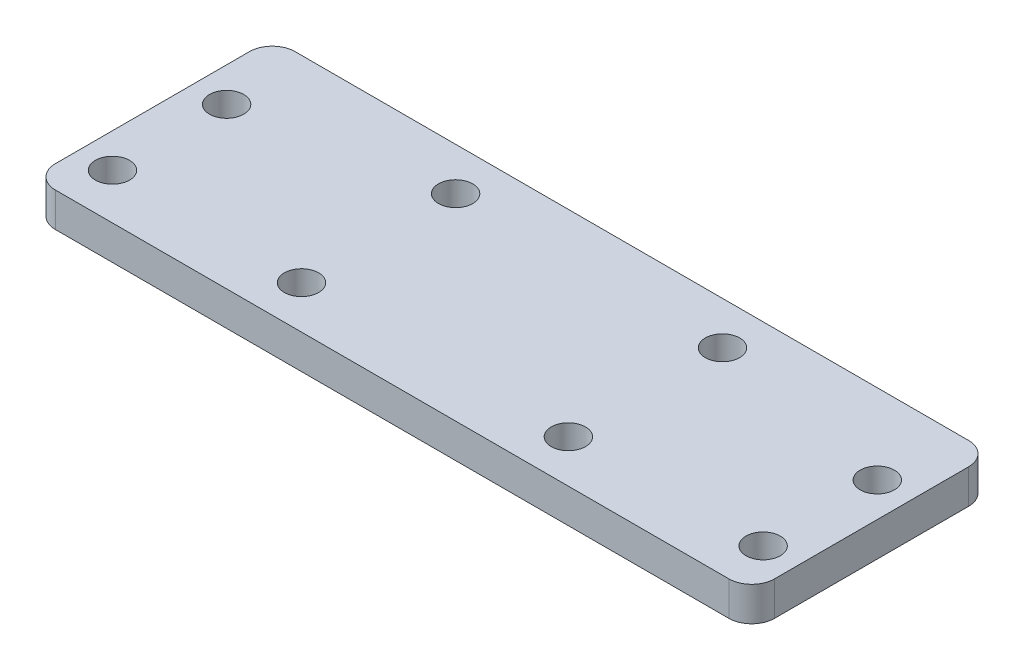
ISO-10303-21;
HEADER;
FILE_DESCRIPTION(('STEP AP214'),'2;1');
FILE_NAME('part.step','',(''),(''),'','','');
FILE_SCHEMA(('AUTOMOTIVE_DESIGN { 1 0 10303 214 1 1 1 1 }'));
ENDSEC;
DATA;
#1=APPLICATION_CONTEXT('core data for automotive mechanical design processes');
#2=APPLICATION_PROTOCOL_DEFINITION('international standard','automotive_design',2000,#1);
#3=PRODUCT_CONTEXT('',#1,'mechanical');
#4=PRODUCT('Part','Part','',(#3));
#5=PRODUCT_RELATED_PRODUCT_CATEGORY('part','',(#4));
#6=PRODUCT_DEFINITION_FORMATION('','',#4);
#7=PRODUCT_DEFINITION_CONTEXT('part definition',#1,'design');
#8=PRODUCT_DEFINITION('design','',#6,#7);
#9=PRODUCT_DEFINITION_SHAPE('','',#8);
#10=(LENGTH_UNIT() NAMED_UNIT(*) SI_UNIT(.MILLI.,.METRE.));
#11=(NAMED_UNIT(*) PLANE_ANGLE_UNIT() SI_UNIT($,.RADIAN.));
#12=(NAMED_UNIT(*) SI_UNIT($,.STERADIAN.) SOLID_ANGLE_UNIT());
#13=UNCERTAINTY_MEASURE_WITH_UNIT(LENGTH_MEASURE(1.E-05),#10,'distance_accuracy_value','');
#14=(GEOMETRIC_REPRESENTATION_CONTEXT(3) GLOBAL_UNCERTAINTY_ASSIGNED_CONTEXT((#13)) GLOBAL_UNIT_ASSIGNED_CONTEXT((#10,
#11,#12)) REPRESENTATION_CONTEXT('',''));
#15=CARTESIAN_POINT('',(0.,0.,0.));
#16=DIRECTION('',(0.,0.,1.));
#17=DIRECTION('',(1.,0.,0.));
#18=AXIS2_PLACEMENT_3D('',#15,#16,#17);
#19=CARTESIAN_POINT('',(0.,3.,0.));
#20=DIRECTION('',(0.,-1.,0.));
#21=DIRECTION('',(0.,0.,-1.));
#22=AXIS2_PLACEMENT_3D('',#19,#20,#21);
#23=PLANE('',#22);
#24=CARTESIAN_POINT('',(-28.5,3.,-3.5));
#25=DIRECTION('',(0.,1.,0.));
#26=DIRECTION('',(0.,0.,1.));
#27=AXIS2_PLACEMENT_3D('',#24,#25,#26);
#28=CIRCLE('',#27,1.5);
#29=CARTESIAN_POINT('',(-28.5,3.,-2.));
#30=VERTEX_POINT('',#29);
#31=EDGE_CURVE('E210',#30,#30,#28,.T.);
#32=ORIENTED_EDGE('',*,*,#31,.F.);
#33=EDGE_LOOP('',(#32));
#34=FACE_BOUND('',#33,.T.);
#35=CARTESIAN_POINT('',(28.5,3.,6.5));
#36=DIRECTION('',(0.,1.,0.));
#37=DIRECTION('',(0.,0.,-1.));
#38=AXIS2_PLACEMENT_3D('',#35,#36,#37);
#39=CIRCLE('',#38,1.5);
#40=CARTESIAN_POINT('',(28.5,3.,5.));
#41=VERTEX_POINT('',#40);
#42=EDGE_CURVE('E214',#41,#41,#39,.T.);
#43=ORIENTED_EDGE('',*,*,#42,.F.);
#44=EDGE_LOOP('',(#43));
#45=FACE_BOUND('',#44,.T.);
#46=CARTESIAN_POINT('',(28.5,3.,-3.5));
#47=DIRECTION('',(0.,1.,0.));
#48=DIRECTION('',(0.,0.,-1.));
#49=AXIS2_PLACEMENT_3D('',#46,#47,#48);
#50=CIRCLE('',#49,1.5);
#51=CARTESIAN_POINT('',(28.5,3.,-5.));
#52=VERTEX_POINT('',#51);
#53=EDGE_CURVE('E211',#52,#52,#50,.T.);
#54=ORIENTED_EDGE('',*,*,#53,.F.);
#55=EDGE_LOOP('',(#54));
#56=FACE_BOUND('',#55,.T.);
#57=CARTESIAN_POINT('',(-28.5,3.,6.5));
#58=DIRECTION('',(0.,1.,0.));
#59=DIRECTION('',(0.,0.,1.));
#60=AXIS2_PLACEMENT_3D('',#57,#58,#59);
#61=CIRCLE('',#60,1.5);
#62=CARTESIAN_POINT('',(-28.5,3.,8.));
#63=VERTEX_POINT('',#62);
#64=EDGE_CURVE('E204',#63,#63,#61,.T.);
#65=ORIENTED_EDGE('',*,*,#64,.F.);
#66=EDGE_LOOP('',(#65));
#67=FACE_BOUND('',#66,.T.);
#68=DIRECTION('',(0.,0.,1.));
#69=VECTOR('',#68,1.);
#70=CARTESIAN_POINT('',(-31.5,3.,10.5));
#71=LINE('',#70,#69);
#72=CARTESIAN_POINT('',(-31.5,3.,-8.49999999999999));
#73=VERTEX_POINT('',#72);
#74=CARTESIAN_POINT('',(-31.5,3.,8.5));
#75=VERTEX_POINT('',#74);
#76=EDGE_CURVE('E177',#73,#75,#71,.T.);
#77=ORIENTED_EDGE('',*,*,#76,.T.);
#78=CARTESIAN_POINT('',(-29.5,3.,8.5));
#79=DIRECTION('',(0.,-1.,0.));
#80=DIRECTION('',(0.,0.,-1.));
#81=AXIS2_PLACEMENT_3D('',#78,#79,#80);
#82=CIRCLE('',#81,2.);
#83=CARTESIAN_POINT('',(-29.5,3.,10.5));
#84=VERTEX_POINT('',#83);
#85=EDGE_CURVE('E157',#75,#84,#82,.F.);
#86=ORIENTED_EDGE('',*,*,#85,.T.);
#87=DIRECTION('',(1.,0.,0.));
#88=VECTOR('',#87,1.);
#89=CARTESIAN_POINT('',(-31.5,3.,10.5));
#90=LINE('',#89,#88);
#91=CARTESIAN_POINT('',(29.5,3.,10.5));
#92=VERTEX_POINT('',#91);
#93=EDGE_CURVE('E130',#84,#92,#90,.T.);
#94=ORIENTED_EDGE('',*,*,#93,.T.);
#95=CARTESIAN_POINT('',(29.5,3.,8.5));
#96=DIRECTION('',(0.,-1.,0.));
#97=DIRECTION('',(0.,0.,-1.));
#98=AXIS2_PLACEMENT_3D('',#95,#96,#97);
#99=CIRCLE('',#98,2.);
#100=CARTESIAN_POINT('',(31.5,3.,8.5));
#101=VERTEX_POINT('',#100);
#102=EDGE_CURVE('E151',#92,#101,#99,.F.);
#103=ORIENTED_EDGE('',*,*,#102,.T.);
#104=DIRECTION('',(0.,0.,-1.));
#105=VECTOR('',#104,1.);
#106=CARTESIAN_POINT('',(31.5,3.,10.5));
#107=LINE('',#106,#105);
#108=CARTESIAN_POINT('',(31.5,3.,-8.49999999999999));
#109=VERTEX_POINT('',#108);
#110=EDGE_CURVE('E132',#101,#109,#107,.T.);
#111=ORIENTED_EDGE('',*,*,#110,.T.);
#112=CARTESIAN_POINT('',(29.5,3.,-8.5));
#113=DIRECTION('',(0.,-1.,0.));
#114=DIRECTION('',(0.,0.,-1.));
#115=AXIS2_PLACEMENT_3D('',#112,#113,#114);
#116=CIRCLE('',#115,2.);
#117=CARTESIAN_POINT('',(29.5,3.,-10.5));
#118=VERTEX_POINT('',#117);
#119=EDGE_CURVE('E64',#109,#118,#116,.F.);
#120=ORIENTED_EDGE('',*,*,#119,.T.);
#121=DIRECTION('',(-1.,0.,0.));
#122=VECTOR('',#121,1.);
#123=CARTESIAN_POINT('',(-31.5,3.,-10.5));
#124=LINE('',#123,#122);
#125=CARTESIAN_POINT('',(-29.5,3.,-10.5));
#126=VERTEX_POINT('',#125);
#127=EDGE_CURVE('E140',#118,#126,#124,.T.);
#128=ORIENTED_EDGE('',*,*,#127,.T.);
#129=CARTESIAN_POINT('',(-29.5,3.,-8.5));
#130=DIRECTION('',(0.,-1.,0.));
#131=DIRECTION('',(0.,0.,-1.));
#132=AXIS2_PLACEMENT_3D('',#129,#130,#131);
#133=CIRCLE('',#132,2.);
#134=EDGE_CURVE('E152',#126,#73,#133,.F.);
#135=ORIENTED_EDGE('',*,*,#134,.T.);
#136=EDGE_LOOP('',(#77,#86,#94,#103,#111,#120,#128,#135));
#137=FACE_BOUND('',#136,.T.);
#138=CARTESIAN_POINT('',(11.69,3.,-6.75));
#139=DIRECTION('',(0.,1.,0.));
#140=DIRECTION('',(0.,0.,1.));
#141=AXIS2_PLACEMENT_3D('',#138,#139,#140);
#142=CIRCLE('',#141,1.5);
#143=CARTESIAN_POINT('',(11.69,3.,-5.25));
#144=VERTEX_POINT('',#143);
#145=EDGE_CURVE('E175',#144,#144,#142,.T.);
#146=ORIENTED_EDGE('',*,*,#145,.F.);
#147=EDGE_LOOP('',(#146));
#148=FACE_BOUND('',#147,.T.);
#149=CARTESIAN_POINT('',(-11.69,3.,-6.75));
#150=DIRECTION('',(0.,1.,0.));
#151=DIRECTION('',(0.,0.,1.));
#152=AXIS2_PLACEMENT_3D('',#149,#150,#151);
#153=CIRCLE('',#152,1.5);
#154=CARTESIAN_POINT('',(-11.69,3.,-5.25));
#155=VERTEX_POINT('',#154);
#156=EDGE_CURVE('E183',#155,#155,#153,.T.);
#157=ORIENTED_EDGE('',*,*,#156,.F.);
#158=EDGE_LOOP('',(#157));
#159=FACE_BOUND('',#158,.T.);
#160=CARTESIAN_POINT('',(11.69,3.,6.75));
#161=DIRECTION('',(0.,1.,0.));
#162=DIRECTION('',(0.,0.,1.));
#163=AXIS2_PLACEMENT_3D('',#160,#161,#162);
#164=CIRCLE('',#163,1.5);
#165=CARTESIAN_POINT('',(11.69,3.,8.25));
#166=VERTEX_POINT('',#165);
#167=EDGE_CURVE('E186',#166,#166,#164,.T.);
#168=ORIENTED_EDGE('',*,*,#167,.F.);
#169=EDGE_LOOP('',(#168));
#170=FACE_BOUND('',#169,.T.);
#171=CARTESIAN_POINT('',(-11.69,3.,6.75));
#172=DIRECTION('',(0.,1.,0.));
#173=DIRECTION('',(0.,0.,1.));
#174=AXIS2_PLACEMENT_3D('',#171,#172,#173);
#175=CIRCLE('',#174,1.5);
#176=CARTESIAN_POINT('',(-11.69,3.,8.25));
#177=VERTEX_POINT('',#176);
#178=EDGE_CURVE('E193',#177,#177,#175,.T.);
#179=ORIENTED_EDGE('',*,*,#178,.F.);
#180=EDGE_LOOP('',(#179));
#181=FACE_BOUND('',#180,.T.);
#182=ADVANCED_FACE('F41',(#34,#45,#56,#67,#137,#148,#159,#170,#181),#23,.F.);
#183=CARTESIAN_POINT('',(0.,0.,0.));
#184=DIRECTION('',(0.,-1.,0.));
#185=DIRECTION('',(0.,0.,-1.));
#186=AXIS2_PLACEMENT_3D('',#183,#184,#185);
#187=PLANE('',#186);
#188=CARTESIAN_POINT('',(-28.5,0.,-3.5));
#189=DIRECTION('',(0.,1.,0.));
#190=DIRECTION('',(0.,0.,1.));
#191=AXIS2_PLACEMENT_3D('',#188,#189,#190);
#192=CIRCLE('',#191,1.5);
#193=CARTESIAN_POINT('',(-28.5,0.,-2.));
#194=VERTEX_POINT('',#193);
#195=EDGE_CURVE('E220',#194,#194,#192,.T.);
#196=ORIENTED_EDGE('',*,*,#195,.T.);
#197=EDGE_LOOP('',(#196));
#198=FACE_BOUND('',#197,.T.);
#199=CARTESIAN_POINT('',(28.5,0.,6.5));
#200=DIRECTION('',(0.,1.,0.));
#201=DIRECTION('',(0.,0.,-1.));
#202=AXIS2_PLACEMENT_3D('',#199,#200,#201);
#203=CIRCLE('',#202,1.5);
#204=CARTESIAN_POINT('',(28.5,0.,5.));
#205=VERTEX_POINT('',#204);
#206=EDGE_CURVE('E208',#205,#205,#203,.T.);
#207=ORIENTED_EDGE('',*,*,#206,.T.);
#208=EDGE_LOOP('',(#207));
#209=FACE_BOUND('',#208,.T.);
#210=CARTESIAN_POINT('',(28.5,0.,-3.5));
#211=DIRECTION('',(0.,1.,0.));
#212=DIRECTION('',(0.,0.,-1.));
#213=AXIS2_PLACEMENT_3D('',#210,#211,#212);
#214=CIRCLE('',#213,1.5);
#215=CARTESIAN_POINT('',(28.5,0.,-5.));
#216=VERTEX_POINT('',#215);
#217=EDGE_CURVE('E225',#216,#216,#214,.T.);
#218=ORIENTED_EDGE('',*,*,#217,.T.);
#219=EDGE_LOOP('',(#218));
#220=FACE_BOUND('',#219,.T.);
#221=CARTESIAN_POINT('',(-28.5,0.,6.5));
#222=DIRECTION('',(0.,1.,0.));
#223=DIRECTION('',(0.,0.,1.));
#224=AXIS2_PLACEMENT_3D('',#221,#222,#223);
#225=CIRCLE('',#224,1.5);
#226=CARTESIAN_POINT('',(-28.5,0.,8.));
#227=VERTEX_POINT('',#226);
#228=EDGE_CURVE('E202',#227,#227,#225,.T.);
#229=ORIENTED_EDGE('',*,*,#228,.T.);
#230=EDGE_LOOP('',(#229));
#231=FACE_BOUND('',#230,.T.);
#232=CARTESIAN_POINT('',(11.69,0.,6.75));
#233=DIRECTION('',(0.,1.,0.));
#234=DIRECTION('',(0.,0.,1.));
#235=AXIS2_PLACEMENT_3D('',#232,#233,#234);
#236=CIRCLE('',#235,1.5);
#237=CARTESIAN_POINT('',(11.69,0.,8.25));
#238=VERTEX_POINT('',#237);
#239=EDGE_CURVE('E195',#238,#238,#236,.T.);
#240=ORIENTED_EDGE('',*,*,#239,.T.);
#241=EDGE_LOOP('',(#240));
#242=FACE_BOUND('',#241,.T.);
#243=CARTESIAN_POINT('',(11.69,0.,-6.75));
#244=DIRECTION('',(0.,1.,0.));
#245=DIRECTION('',(0.,0.,1.));
#246=AXIS2_PLACEMENT_3D('',#243,#244,#245);
#247=CIRCLE('',#246,1.5);
#248=CARTESIAN_POINT('',(11.69,0.,-5.25));
#249=VERTEX_POINT('',#248);
#250=EDGE_CURVE('E174',#249,#249,#247,.T.);
#251=ORIENTED_EDGE('',*,*,#250,.T.);
#252=EDGE_LOOP('',(#251));
#253=FACE_BOUND('',#252,.T.);
#254=DIRECTION('',(1.,0.,0.));
#255=VECTOR('',#254,1.);
#256=CARTESIAN_POINT('',(-31.5,0.,10.5));
#257=LINE('',#256,#255);
#258=CARTESIAN_POINT('',(-29.5,0.,10.5));
#259=VERTEX_POINT('',#258);
#260=CARTESIAN_POINT('',(29.5,0.,10.5));
#261=VERTEX_POINT('',#260);
#262=EDGE_CURVE('E121',#259,#261,#257,.T.);
#263=ORIENTED_EDGE('',*,*,#262,.F.);
#264=CARTESIAN_POINT('',(-29.5,0.,8.5));
#265=DIRECTION('',(0.,-1.,0.));
#266=DIRECTION('',(0.,0.,-1.));
#267=AXIS2_PLACEMENT_3D('',#264,#265,#266);
#268=CIRCLE('',#267,2.);
#269=CARTESIAN_POINT('',(-31.5,0.,8.5));
#270=VERTEX_POINT('',#269);
#271=EDGE_CURVE('E110',#259,#270,#268,.T.);
#272=ORIENTED_EDGE('',*,*,#271,.T.);
#273=DIRECTION('',(0.,0.,1.));
#274=VECTOR('',#273,1.);
#275=CARTESIAN_POINT('',(-31.5,0.,10.5));
#276=LINE('',#275,#274);
#277=CARTESIAN_POINT('',(-31.5,0.,-8.49999999999999));
#278=VERTEX_POINT('',#277);
#279=EDGE_CURVE('E134',#278,#270,#276,.T.);
#280=ORIENTED_EDGE('',*,*,#279,.F.);
#281=CARTESIAN_POINT('',(-29.5,0.,-8.5));
#282=DIRECTION('',(0.,-1.,0.));
#283=DIRECTION('',(0.,0.,-1.));
#284=AXIS2_PLACEMENT_3D('',#281,#282,#283);
#285=CIRCLE('',#284,2.);
#286=CARTESIAN_POINT('',(-29.5,0.,-10.5));
#287=VERTEX_POINT('',#286);
#288=EDGE_CURVE('E117',#278,#287,#285,.T.);
#289=ORIENTED_EDGE('',*,*,#288,.T.);
#290=DIRECTION('',(-1.,0.,0.));
#291=VECTOR('',#290,1.);
#292=CARTESIAN_POINT('',(-31.5,0.,-10.5));
#293=LINE('',#292,#291);
#294=CARTESIAN_POINT('',(29.5,0.,-10.5));
#295=VERTEX_POINT('',#294);
#296=EDGE_CURVE('E139',#295,#287,#293,.T.);
#297=ORIENTED_EDGE('',*,*,#296,.F.);
#298=CARTESIAN_POINT('',(29.5,0.,-8.5));
#299=DIRECTION('',(0.,-1.,0.));
#300=DIRECTION('',(0.,0.,-1.));
#301=AXIS2_PLACEMENT_3D('',#298,#299,#300);
#302=CIRCLE('',#301,2.);
#303=CARTESIAN_POINT('',(31.5,0.,-8.49999999999999));
#304=VERTEX_POINT('',#303);
#305=EDGE_CURVE('E143',#295,#304,#302,.T.);
#306=ORIENTED_EDGE('',*,*,#305,.T.);
#307=DIRECTION('',(0.,0.,-1.));
#308=VECTOR('',#307,1.);
#309=CARTESIAN_POINT('',(31.5,0.,10.5));
#310=LINE('',#309,#308);
#311=CARTESIAN_POINT('',(31.5,0.,8.5));
#312=VERTEX_POINT('',#311);
#313=EDGE_CURVE('E170',#312,#304,#310,.T.);
#314=ORIENTED_EDGE('',*,*,#313,.F.);
#315=CARTESIAN_POINT('',(29.5,0.,8.5));
#316=DIRECTION('',(0.,-1.,0.));
#317=DIRECTION('',(0.,0.,-1.));
#318=AXIS2_PLACEMENT_3D('',#315,#316,#317);
#319=CIRCLE('',#318,2.);
#320=EDGE_CURVE('E129',#312,#261,#319,.T.);
#321=ORIENTED_EDGE('',*,*,#320,.T.);
#322=EDGE_LOOP('',(#263,#272,#280,#289,#297,#306,#314,#321));
#323=FACE_BOUND('',#322,.T.);
#324=CARTESIAN_POINT('',(-11.69,0.,-6.75));
#325=DIRECTION('',(0.,1.,0.));
#326=DIRECTION('',(0.,0.,1.));
#327=AXIS2_PLACEMENT_3D('',#324,#325,#326);
#328=CIRCLE('',#327,1.5);
#329=CARTESIAN_POINT('',(-11.69,0.,-5.25));
#330=VERTEX_POINT('',#329);
#331=EDGE_CURVE('E187',#330,#330,#328,.T.);
#332=ORIENTED_EDGE('',*,*,#331,.T.);
#333=EDGE_LOOP('',(#332));
#334=FACE_BOUND('',#333,.T.);
#335=CARTESIAN_POINT('',(-11.69,0.,6.75));
#336=DIRECTION('',(0.,1.,0.));
#337=DIRECTION('',(0.,0.,1.));
#338=AXIS2_PLACEMENT_3D('',#335,#336,#337);
#339=CIRCLE('',#338,1.5);
#340=CARTESIAN_POINT('',(-11.69,0.,8.25));
#341=VERTEX_POINT('',#340);
#342=EDGE_CURVE('E198',#341,#341,#339,.T.);
#343=ORIENTED_EDGE('',*,*,#342,.T.);
#344=EDGE_LOOP('',(#343));
#345=FACE_BOUND('',#344,.T.);
#346=ADVANCED_FACE('F131',(#198,#209,#220,#231,#242,#253,#323,#334,#345),#187,.T.);
#347=CARTESIAN_POINT('',(31.5,3.,10.5));
#348=DIRECTION('',(-1.,0.,0.));
#349=DIRECTION('',(0.,0.,1.));
#350=AXIS2_PLACEMENT_3D('',#347,#348,#349);
#351=PLANE('',#350);
#352=ORIENTED_EDGE('',*,*,#313,.T.);
#353=DIRECTION('',(0.,-1.,0.));
#354=VECTOR('',#353,1.);
#355=CARTESIAN_POINT('',(31.5,3.,-8.5));
#356=LINE('',#355,#354);
#357=EDGE_CURVE('E11',#304,#109,#356,.F.);
#358=ORIENTED_EDGE('',*,*,#357,.T.);
#359=ORIENTED_EDGE('',*,*,#110,.F.);
#360=DIRECTION('',(0.,-1.,0.));
#361=VECTOR('',#360,1.);
#362=CARTESIAN_POINT('',(31.5,3.,8.5));
#363=LINE('',#362,#361);
#364=EDGE_CURVE('E47',#101,#312,#363,.T.);
#365=ORIENTED_EDGE('',*,*,#364,.T.);
#366=EDGE_LOOP('',(#352,#358,#359,#365));
#367=FACE_BOUND('',#366,.T.);
#368=ADVANCED_FACE('F168',(#367),#351,.F.);
#369=CARTESIAN_POINT('',(-31.5,3.,-10.5));
#370=DIRECTION('',(0.,0.,1.));
#371=DIRECTION('',(1.,0.,0.));
#372=AXIS2_PLACEMENT_3D('',#369,#370,#371);
#373=PLANE('',#372);
#374=ORIENTED_EDGE('',*,*,#296,.T.);
#375=DIRECTION('',(0.,-1.,0.));
#376=VECTOR('',#375,1.);
#377=CARTESIAN_POINT('',(-29.5,3.,-10.5));
#378=LINE('',#377,#376);
#379=EDGE_CURVE('E57',#287,#126,#378,.F.);
#380=ORIENTED_EDGE('',*,*,#379,.T.);
#381=ORIENTED_EDGE('',*,*,#127,.F.);
#382=DIRECTION('',(0.,-1.,0.));
#383=VECTOR('',#382,1.);
#384=CARTESIAN_POINT('',(29.5,3.,-10.5));
#385=LINE('',#384,#383);
#386=EDGE_CURVE('E158',#118,#295,#385,.T.);
#387=ORIENTED_EDGE('',*,*,#386,.T.);
#388=EDGE_LOOP('',(#374,#380,#381,#387));
#389=FACE_BOUND('',#388,.T.);
#390=ADVANCED_FACE('F256',(#389),#373,.F.);
#391=CARTESIAN_POINT('',(-31.5,3.,10.5));
#392=DIRECTION('',(1.,0.,0.));
#393=DIRECTION('',(0.,0.,-1.));
#394=AXIS2_PLACEMENT_3D('',#391,#392,#393);
#395=PLANE('',#394);
#396=ORIENTED_EDGE('',*,*,#279,.T.);
#397=DIRECTION('',(0.,-1.,0.));
#398=VECTOR('',#397,1.);
#399=CARTESIAN_POINT('',(-31.5,3.,8.5));
#400=LINE('',#399,#398);
#401=EDGE_CURVE('E115',#270,#75,#400,.F.);
#402=ORIENTED_EDGE('',*,*,#401,.T.);
#403=ORIENTED_EDGE('',*,*,#76,.F.);
#404=DIRECTION('',(0.,-1.,0.));
#405=VECTOR('',#404,1.);
#406=CARTESIAN_POINT('',(-31.5,3.,-8.5));
#407=LINE('',#406,#405);
#408=EDGE_CURVE('E120',#73,#278,#407,.T.);
#409=ORIENTED_EDGE('',*,*,#408,.T.);
#410=EDGE_LOOP('',(#396,#402,#403,#409));
#411=FACE_BOUND('',#410,.T.);
#412=ADVANCED_FACE('F270',(#411),#395,.F.);
#413=CARTESIAN_POINT('',(-31.5,3.,10.5));
#414=DIRECTION('',(0.,0.,-1.));
#415=DIRECTION('',(-1.,0.,0.));
#416=AXIS2_PLACEMENT_3D('',#413,#414,#415);
#417=PLANE('',#416);
#418=ORIENTED_EDGE('',*,*,#93,.F.);
#419=DIRECTION('',(0.,-1.,0.));
#420=VECTOR('',#419,1.);
#421=CARTESIAN_POINT('',(-29.5,3.,10.5));
#422=LINE('',#421,#420);
#423=EDGE_CURVE('E111',#84,#259,#422,.T.);
#424=ORIENTED_EDGE('',*,*,#423,.T.);
#425=ORIENTED_EDGE('',*,*,#262,.T.);
#426=DIRECTION('',(0.,-1.,0.));
#427=VECTOR('',#426,1.);
#428=CARTESIAN_POINT('',(29.5,3.,10.5));
#429=LINE('',#428,#427);
#430=EDGE_CURVE('E126',#261,#92,#429,.F.);
#431=ORIENTED_EDGE('',*,*,#430,.T.);
#432=EDGE_LOOP('',(#418,#424,#425,#431));
#433=FACE_BOUND('',#432,.T.);
#434=ADVANCED_FACE('F124',(#433),#417,.F.);
#435=CARTESIAN_POINT('',(11.69,3.,-6.75));
#436=DIRECTION('',(0.,-1.,0.));
#437=DIRECTION('',(0.,0.,-1.));
#438=AXIS2_PLACEMENT_3D('',#435,#436,#437);
#439=CYLINDRICAL_SURFACE('',#438,1.5);
#440=ORIENTED_EDGE('',*,*,#145,.T.);
#441=EDGE_LOOP('',(#440));
#442=FACE_BOUND('',#441,.T.);
#443=ORIENTED_EDGE('',*,*,#250,.F.);
#444=EDGE_LOOP('',(#443));
#445=FACE_BOUND('',#444,.T.);
#446=ADVANCED_FACE('F267',(#442,#445),#439,.F.);
#447=CARTESIAN_POINT('',(-11.69,3.,-6.75));
#448=DIRECTION('',(0.,-1.,0.));
#449=DIRECTION('',(0.,0.,-1.));
#450=AXIS2_PLACEMENT_3D('',#447,#448,#449);
#451=CYLINDRICAL_SURFACE('',#450,1.5);
#452=ORIENTED_EDGE('',*,*,#156,.T.);
#453=EDGE_LOOP('',(#452));
#454=FACE_BOUND('',#453,.T.);
#455=ORIENTED_EDGE('',*,*,#331,.F.);
#456=EDGE_LOOP('',(#455));
#457=FACE_BOUND('',#456,.T.);
#458=ADVANCED_FACE('F304',(#454,#457),#451,.F.);
#459=CARTESIAN_POINT('',(11.69,3.,6.75));
#460=DIRECTION('',(0.,-1.,0.));
#461=DIRECTION('',(0.,0.,-1.));
#462=AXIS2_PLACEMENT_3D('',#459,#460,#461);
#463=CYLINDRICAL_SURFACE('',#462,1.5);
#464=ORIENTED_EDGE('',*,*,#167,.T.);
#465=EDGE_LOOP('',(#464));
#466=FACE_BOUND('',#465,.T.);
#467=ORIENTED_EDGE('',*,*,#239,.F.);
#468=EDGE_LOOP('',(#467));
#469=FACE_BOUND('',#468,.T.);
#470=ADVANCED_FACE('F247',(#466,#469),#463,.F.);
#471=CARTESIAN_POINT('',(-11.69,3.,6.75));
#472=DIRECTION('',(0.,-1.,0.));
#473=DIRECTION('',(0.,0.,-1.));
#474=AXIS2_PLACEMENT_3D('',#471,#472,#473);
#475=CYLINDRICAL_SURFACE('',#474,1.5);
#476=ORIENTED_EDGE('',*,*,#178,.T.);
#477=EDGE_LOOP('',(#476));
#478=FACE_BOUND('',#477,.T.);
#479=ORIENTED_EDGE('',*,*,#342,.F.);
#480=EDGE_LOOP('',(#479));
#481=FACE_BOUND('',#480,.T.);
#482=ADVANCED_FACE('F244',(#478,#481),#475,.F.);
#483=CARTESIAN_POINT('',(-29.5,3.,8.5));
#484=DIRECTION('',(0.,-1.,0.));
#485=DIRECTION('',(0.,0.,-1.));
#486=AXIS2_PLACEMENT_3D('',#483,#484,#485);
#487=CYLINDRICAL_SURFACE('',#486,2.);
#488=ORIENTED_EDGE('',*,*,#85,.F.);
#489=ORIENTED_EDGE('',*,*,#401,.F.);
#490=ORIENTED_EDGE('',*,*,#271,.F.);
#491=ORIENTED_EDGE('',*,*,#423,.F.);
#492=EDGE_LOOP('',(#488,#489,#490,#491));
#493=FACE_BOUND('',#492,.T.);
#494=ADVANCED_FACE('F109',(#493),#487,.T.);
#495=CARTESIAN_POINT('',(-29.5,3.,-8.5));
#496=DIRECTION('',(0.,-1.,0.));
#497=DIRECTION('',(0.,0.,-1.));
#498=AXIS2_PLACEMENT_3D('',#495,#496,#497);
#499=CYLINDRICAL_SURFACE('',#498,2.);
#500=ORIENTED_EDGE('',*,*,#134,.F.);
#501=ORIENTED_EDGE('',*,*,#379,.F.);
#502=ORIENTED_EDGE('',*,*,#288,.F.);
#503=ORIENTED_EDGE('',*,*,#408,.F.);
#504=EDGE_LOOP('',(#500,#501,#502,#503));
#505=FACE_BOUND('',#504,.T.);
#506=ADVANCED_FACE('F273',(#505),#499,.T.);
#507=CARTESIAN_POINT('',(29.5,3.,-8.5));
#508=DIRECTION('',(0.,-1.,0.));
#509=DIRECTION('',(0.,0.,-1.));
#510=AXIS2_PLACEMENT_3D('',#507,#508,#509);
#511=CYLINDRICAL_SURFACE('',#510,2.);
#512=ORIENTED_EDGE('',*,*,#119,.F.);
#513=ORIENTED_EDGE('',*,*,#357,.F.);
#514=ORIENTED_EDGE('',*,*,#305,.F.);
#515=ORIENTED_EDGE('',*,*,#386,.F.);
#516=EDGE_LOOP('',(#512,#513,#514,#515));
#517=FACE_BOUND('',#516,.T.);
#518=ADVANCED_FACE('F280',(#517),#511,.T.);
#519=CARTESIAN_POINT('',(29.5,3.,8.5));
#520=DIRECTION('',(0.,-1.,0.));
#521=DIRECTION('',(0.,0.,-1.));
#522=AXIS2_PLACEMENT_3D('',#519,#520,#521);
#523=CYLINDRICAL_SURFACE('',#522,2.);
#524=ORIENTED_EDGE('',*,*,#102,.F.);
#525=ORIENTED_EDGE('',*,*,#430,.F.);
#526=ORIENTED_EDGE('',*,*,#320,.F.);
#527=ORIENTED_EDGE('',*,*,#364,.F.);
#528=EDGE_LOOP('',(#524,#525,#526,#527));
#529=FACE_BOUND('',#528,.T.);
#530=ADVANCED_FACE('F43',(#529),#523,.T.);
#531=CARTESIAN_POINT('',(-28.5,0.,6.5));
#532=DIRECTION('',(0.,1.,0.));
#533=DIRECTION('',(0.,0.,1.));
#534=AXIS2_PLACEMENT_3D('',#531,#532,#533);
#535=CYLINDRICAL_SURFACE('',#534,1.5);
#536=ORIENTED_EDGE('',*,*,#228,.F.);
#537=EDGE_LOOP('',(#536));
#538=FACE_BOUND('',#537,.T.);
#539=ORIENTED_EDGE('',*,*,#64,.T.);
#540=EDGE_LOOP('',(#539));
#541=FACE_BOUND('',#540,.T.);
#542=ADVANCED_FACE('F282',(#538,#541),#535,.F.);
#543=CARTESIAN_POINT('',(28.5,0.,-3.5));
#544=DIRECTION('',(0.,1.,0.));
#545=DIRECTION('',(0.,0.,1.));
#546=AXIS2_PLACEMENT_3D('',#543,#544,#545);
#547=CYLINDRICAL_SURFACE('',#546,1.5);
#548=ORIENTED_EDGE('',*,*,#217,.F.);
#549=EDGE_LOOP('',(#548));
#550=FACE_BOUND('',#549,.T.);
#551=ORIENTED_EDGE('',*,*,#53,.T.);
#552=EDGE_LOOP('',(#551));
#553=FACE_BOUND('',#552,.T.);
#554=ADVANCED_FACE('F226',(#550,#553),#547,.F.);
#555=CARTESIAN_POINT('',(28.5,0.,6.5));
#556=DIRECTION('',(0.,1.,0.));
#557=DIRECTION('',(0.,0.,1.));
#558=AXIS2_PLACEMENT_3D('',#555,#556,#557);
#559=CYLINDRICAL_SURFACE('',#558,1.5);
#560=ORIENTED_EDGE('',*,*,#206,.F.);
#561=EDGE_LOOP('',(#560));
#562=FACE_BOUND('',#561,.T.);
#563=ORIENTED_EDGE('',*,*,#42,.T.);
#564=EDGE_LOOP('',(#563));
#565=FACE_BOUND('',#564,.T.);
#566=ADVANCED_FACE('F294',(#562,#565),#559,.F.);
#567=CARTESIAN_POINT('',(-28.5,0.,-3.5));
#568=DIRECTION('',(0.,1.,0.));
#569=DIRECTION('',(0.,0.,1.));
#570=AXIS2_PLACEMENT_3D('',#567,#568,#569);
#571=CYLINDRICAL_SURFACE('',#570,1.5);
#572=ORIENTED_EDGE('',*,*,#195,.F.);
#573=EDGE_LOOP('',(#572));
#574=FACE_BOUND('',#573,.T.);
#575=ORIENTED_EDGE('',*,*,#31,.T.);
#576=EDGE_LOOP('',(#575));
#577=FACE_BOUND('',#576,.T.);
#578=ADVANCED_FACE('F386',(#574,#577),#571,.F.);
#579=CLOSED_SHELL('',(#182,#346,#368,#390,#412,#434,#446,#458,#470,#482,#494,#506,#518,#530,
#542,#554,#566,#578));
#580=MANIFOLD_SOLID_BREP('B2',#579);
#581=ADVANCED_BREP_SHAPE_REPRESENTATION('',(#18,#580),#14);
#582=SHAPE_DEFINITION_REPRESENTATION(#9,#581);
ENDSEC;
END-ISO-10303-21;
